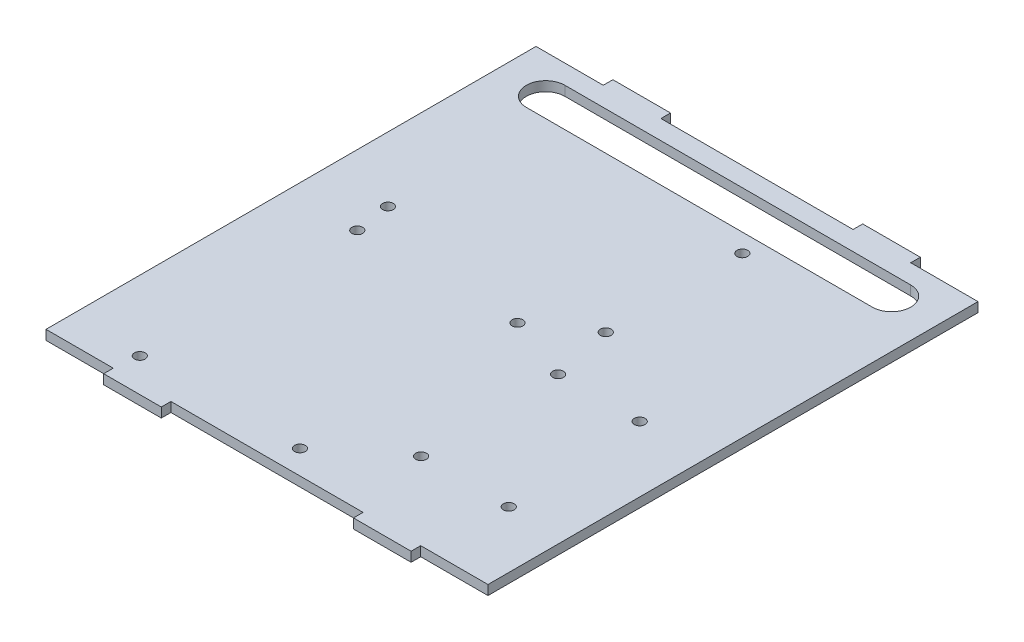
ISO-10303-21;
HEADER;
FILE_DESCRIPTION(('STEP AP214'),'2;1');
FILE_NAME('part.step','',(''),(''),'','','');
FILE_SCHEMA(('AUTOMOTIVE_DESIGN { 1 0 10303 214 1 1 1 1 }'));
ENDSEC;
DATA;
#1=APPLICATION_CONTEXT('core data for automotive mechanical design processes');
#2=APPLICATION_PROTOCOL_DEFINITION('international standard','automotive_design',2000,#1);
#3=PRODUCT_CONTEXT('',#1,'mechanical');
#4=PRODUCT('Part','Part','',(#3));
#5=PRODUCT_RELATED_PRODUCT_CATEGORY('part','',(#4));
#6=PRODUCT_DEFINITION_FORMATION('','',#4);
#7=PRODUCT_DEFINITION_CONTEXT('part definition',#1,'design');
#8=PRODUCT_DEFINITION('design','',#6,#7);
#9=PRODUCT_DEFINITION_SHAPE('','',#8);
#10=(LENGTH_UNIT() NAMED_UNIT(*) SI_UNIT(.MILLI.,.METRE.));
#11=(NAMED_UNIT(*) PLANE_ANGLE_UNIT() SI_UNIT($,.RADIAN.));
#12=(NAMED_UNIT(*) SI_UNIT($,.STERADIAN.) SOLID_ANGLE_UNIT());
#13=UNCERTAINTY_MEASURE_WITH_UNIT(LENGTH_MEASURE(1.E-05),#10,'distance_accuracy_value','');
#14=(GEOMETRIC_REPRESENTATION_CONTEXT(3) GLOBAL_UNCERTAINTY_ASSIGNED_CONTEXT((#13)) GLOBAL_UNIT_ASSIGNED_CONTEXT((#10,
#11,#12)) REPRESENTATION_CONTEXT('',''));
#15=CARTESIAN_POINT('',(0.,0.,0.));
#16=DIRECTION('',(0.,0.,1.));
#17=DIRECTION('',(1.,0.,0.));
#18=AXIS2_PLACEMENT_3D('',#15,#16,#17);
#19=CARTESIAN_POINT('',(73.025,3.175,80.9625));
#20=DIRECTION('',(0.,0.,-1.));
#21=DIRECTION('',(-1.,0.,0.));
#22=AXIS2_PLACEMENT_3D('',#19,#20,#21);
#23=PLANE('',#22);
#24=DIRECTION('',(1.,0.,0.));
#25=VECTOR('',#24,1.);
#26=CARTESIAN_POINT('',(73.025,0.,80.9625));
#27=LINE('',#26,#25);
#28=CARTESIAN_POINT('',(-73.025,0.,80.9625));
#29=VERTEX_POINT('',#28);
#30=CARTESIAN_POINT('',(-50.8,0.,80.9625));
#31=VERTEX_POINT('',#30);
#32=EDGE_CURVE('E279',#29,#31,#27,.T.);
#33=ORIENTED_EDGE('',*,*,#32,.T.);
#34=DIRECTION('',(0.,1.,0.));
#35=VECTOR('',#34,1.);
#36=CARTESIAN_POINT('',(-50.8,-19.3127710336968,80.9625));
#37=LINE('',#36,#35);
#38=CARTESIAN_POINT('',(-50.8,3.175,80.9625));
#39=VERTEX_POINT('',#38);
#40=EDGE_CURVE('E241',#31,#39,#37,.T.);
#41=ORIENTED_EDGE('',*,*,#40,.T.);
#42=DIRECTION('',(1.,0.,0.));
#43=VECTOR('',#42,1.);
#44=CARTESIAN_POINT('',(73.025,3.175,80.9625));
#45=LINE('',#44,#43);
#46=CARTESIAN_POINT('',(-73.025,3.175,80.9625));
#47=VERTEX_POINT('',#46);
#48=EDGE_CURVE('E381',#47,#39,#45,.T.);
#49=ORIENTED_EDGE('',*,*,#48,.F.);
#50=DIRECTION('',(0.,-1.,0.));
#51=VECTOR('',#50,1.);
#52=CARTESIAN_POINT('',(-73.025,3.175,80.9625));
#53=LINE('',#52,#51);
#54=EDGE_CURVE('E329',#47,#29,#53,.T.);
#55=ORIENTED_EDGE('',*,*,#54,.T.);
#56=EDGE_LOOP('',(#33,#41,#49,#55));
#57=FACE_BOUND('',#56,.T.);
#58=ADVANCED_FACE('F34',(#57),#23,.F.);
#59=DIRECTION('',(0.,1.,0.));
#60=VECTOR('',#59,1.);
#61=CARTESIAN_POINT('',(50.8,-19.3127710336968,80.9625));
#62=LINE('',#61,#60);
#63=CARTESIAN_POINT('',(50.8,0.,80.9625));
#64=VERTEX_POINT('',#63);
#65=CARTESIAN_POINT('',(50.8,3.175,80.9625));
#66=VERTEX_POINT('',#65);
#67=EDGE_CURVE('E267',#64,#66,#62,.T.);
#68=ORIENTED_EDGE('',*,*,#67,.F.);
#69=CARTESIAN_POINT('',(73.025,0.,80.9625));
#70=VERTEX_POINT('',#69);
#71=EDGE_CURVE('E280',#64,#70,#27,.T.);
#72=ORIENTED_EDGE('',*,*,#71,.T.);
#73=DIRECTION('',(0.,-1.,0.));
#74=VECTOR('',#73,1.);
#75=CARTESIAN_POINT('',(73.025,3.175,80.9625));
#76=LINE('',#75,#74);
#77=CARTESIAN_POINT('',(73.025,3.175,80.9625));
#78=VERTEX_POINT('',#77);
#79=EDGE_CURVE('E327',#78,#70,#76,.T.);
#80=ORIENTED_EDGE('',*,*,#79,.F.);
#81=EDGE_CURVE('E382',#66,#78,#45,.T.);
#82=ORIENTED_EDGE('',*,*,#81,.F.);
#83=EDGE_LOOP('',(#68,#72,#80,#82));
#84=FACE_BOUND('',#83,.T.);
#85=ADVANCED_FACE('F358',(#84),#23,.F.);
#86=CARTESIAN_POINT('',(73.025,3.175,-80.9625));
#87=DIRECTION('',(0.,0.,1.));
#88=DIRECTION('',(1.,0.,0.));
#89=AXIS2_PLACEMENT_3D('',#86,#87,#88);
#90=PLANE('',#89);
#91=DIRECTION('',(-1.,0.,0.));
#92=VECTOR('',#91,1.);
#93=CARTESIAN_POINT('',(73.025,3.175,-80.9625));
#94=LINE('',#93,#92);
#95=CARTESIAN_POINT('',(31.75,3.175,-80.9625));
#96=VERTEX_POINT('',#95);
#97=CARTESIAN_POINT('',(-31.75,3.175,-80.9625));
#98=VERTEX_POINT('',#97);
#99=EDGE_CURVE('E297',#96,#98,#94,.T.);
#100=ORIENTED_EDGE('',*,*,#99,.F.);
#101=DIRECTION('',(0.,1.,0.));
#102=VECTOR('',#101,1.);
#103=CARTESIAN_POINT('',(31.75,-19.3127710336968,-80.9625));
#104=LINE('',#103,#102);
#105=CARTESIAN_POINT('',(31.75,0.,-80.9625));
#106=VERTEX_POINT('',#105);
#107=EDGE_CURVE('E477',#106,#96,#104,.T.);
#108=ORIENTED_EDGE('',*,*,#107,.F.);
#109=DIRECTION('',(-1.,0.,0.));
#110=VECTOR('',#109,1.);
#111=CARTESIAN_POINT('',(73.025,0.,-80.9625));
#112=LINE('',#111,#110);
#113=CARTESIAN_POINT('',(-31.75,0.,-80.9625));
#114=VERTEX_POINT('',#113);
#115=EDGE_CURVE('E301',#106,#114,#112,.T.);
#116=ORIENTED_EDGE('',*,*,#115,.T.);
#117=DIRECTION('',(0.,1.,0.));
#118=VECTOR('',#117,1.);
#119=CARTESIAN_POINT('',(-31.75,-19.3127710336968,-80.9625));
#120=LINE('',#119,#118);
#121=EDGE_CURVE('E413',#114,#98,#120,.T.);
#122=ORIENTED_EDGE('',*,*,#121,.T.);
#123=EDGE_LOOP('',(#100,#108,#116,#122));
#124=FACE_BOUND('',#123,.T.);
#125=ADVANCED_FACE('F363',(#124),#90,.F.);
#126=DIRECTION('',(0.,1.,0.));
#127=VECTOR('',#126,1.);
#128=CARTESIAN_POINT('',(-50.8,-19.3127710336968,-80.9625));
#129=LINE('',#128,#127);
#130=CARTESIAN_POINT('',(-50.8,0.,-80.9625));
#131=VERTEX_POINT('',#130);
#132=CARTESIAN_POINT('',(-50.8,3.175,-80.9625));
#133=VERTEX_POINT('',#132);
#134=EDGE_CURVE('E410',#131,#133,#129,.T.);
#135=ORIENTED_EDGE('',*,*,#134,.F.);
#136=CARTESIAN_POINT('',(-73.025,0.,-80.9625));
#137=VERTEX_POINT('',#136);
#138=EDGE_CURVE('E314',#131,#137,#112,.T.);
#139=ORIENTED_EDGE('',*,*,#138,.T.);
#140=DIRECTION('',(0.,-1.,0.));
#141=VECTOR('',#140,1.);
#142=CARTESIAN_POINT('',(-73.025,3.175,-80.9625));
#143=LINE('',#142,#141);
#144=CARTESIAN_POINT('',(-73.025,3.175,-80.9625));
#145=VERTEX_POINT('',#144);
#146=EDGE_CURVE('E313',#145,#137,#143,.T.);
#147=ORIENTED_EDGE('',*,*,#146,.F.);
#148=EDGE_CURVE('E300',#133,#145,#94,.T.);
#149=ORIENTED_EDGE('',*,*,#148,.F.);
#150=EDGE_LOOP('',(#135,#139,#147,#149));
#151=FACE_BOUND('',#150,.T.);
#152=ADVANCED_FACE('F375',(#151),#90,.F.);
#153=CARTESIAN_POINT('',(-73.025,3.175,80.9625));
#154=DIRECTION('',(1.,0.,0.));
#155=DIRECTION('',(0.,0.,-1.));
#156=AXIS2_PLACEMENT_3D('',#153,#154,#155);
#157=PLANE('',#156);
#158=DIRECTION('',(0.,0.,1.));
#159=VECTOR('',#158,1.);
#160=CARTESIAN_POINT('',(-73.025,0.,80.9625));
#161=LINE('',#160,#159);
#162=EDGE_CURVE('E287',#137,#29,#161,.T.);
#163=ORIENTED_EDGE('',*,*,#162,.T.);
#164=ORIENTED_EDGE('',*,*,#54,.F.);
#165=DIRECTION('',(0.,0.,1.));
#166=VECTOR('',#165,1.);
#167=CARTESIAN_POINT('',(-73.025,3.175,80.9625));
#168=LINE('',#167,#166);
#169=EDGE_CURVE('E398',#145,#47,#168,.T.);
#170=ORIENTED_EDGE('',*,*,#169,.F.);
#171=ORIENTED_EDGE('',*,*,#146,.T.);
#172=EDGE_LOOP('',(#163,#164,#170,#171));
#173=FACE_BOUND('',#172,.T.);
#174=ADVANCED_FACE('F36',(#173),#157,.F.);
#175=CARTESIAN_POINT('',(-31.75,3.175,80.9625));
#176=VERTEX_POINT('',#175);
#177=CARTESIAN_POINT('',(31.75,3.175,80.9625));
#178=VERTEX_POINT('',#177);
#179=EDGE_CURVE('E281',#176,#178,#45,.T.);
#180=ORIENTED_EDGE('',*,*,#179,.F.);
#181=DIRECTION('',(0.,1.,0.));
#182=VECTOR('',#181,1.);
#183=CARTESIAN_POINT('',(-31.75,-19.3127710336968,80.9625));
#184=LINE('',#183,#182);
#185=CARTESIAN_POINT('',(-31.75,0.,80.9625));
#186=VERTEX_POINT('',#185);
#187=EDGE_CURVE('E243',#186,#176,#184,.T.);
#188=ORIENTED_EDGE('',*,*,#187,.F.);
#189=CARTESIAN_POINT('',(31.75,0.,80.9625));
#190=VERTEX_POINT('',#189);
#191=EDGE_CURVE('E276',#186,#190,#27,.T.);
#192=ORIENTED_EDGE('',*,*,#191,.T.);
#193=DIRECTION('',(0.,1.,0.));
#194=VECTOR('',#193,1.);
#195=CARTESIAN_POINT('',(31.75,-19.3127710336968,80.9625));
#196=LINE('',#195,#194);
#197=EDGE_CURVE('E258',#190,#178,#196,.T.);
#198=ORIENTED_EDGE('',*,*,#197,.T.);
#199=EDGE_LOOP('',(#180,#188,#192,#198));
#200=FACE_BOUND('',#199,.T.);
#201=ADVANCED_FACE('F359',(#200),#23,.F.);
#202=CARTESIAN_POINT('',(73.025,3.175,80.9625));
#203=DIRECTION('',(-1.,0.,0.));
#204=DIRECTION('',(0.,0.,1.));
#205=AXIS2_PLACEMENT_3D('',#202,#203,#204);
#206=PLANE('',#205);
#207=DIRECTION('',(0.,0.,-1.));
#208=VECTOR('',#207,1.);
#209=CARTESIAN_POINT('',(73.025,0.,80.9625));
#210=LINE('',#209,#208);
#211=CARTESIAN_POINT('',(73.025,0.,-80.9625));
#212=VERTEX_POINT('',#211);
#213=EDGE_CURVE('E289',#70,#212,#210,.T.);
#214=ORIENTED_EDGE('',*,*,#213,.T.);
#215=DIRECTION('',(0.,-1.,0.));
#216=VECTOR('',#215,1.);
#217=CARTESIAN_POINT('',(73.025,3.175,-80.9625));
#218=LINE('',#217,#216);
#219=CARTESIAN_POINT('',(73.025,3.175,-80.9625));
#220=VERTEX_POINT('',#219);
#221=EDGE_CURVE('E324',#220,#212,#218,.T.);
#222=ORIENTED_EDGE('',*,*,#221,.F.);
#223=DIRECTION('',(0.,0.,-1.));
#224=VECTOR('',#223,1.);
#225=CARTESIAN_POINT('',(73.025,3.175,80.9625));
#226=LINE('',#225,#224);
#227=EDGE_CURVE('E305',#78,#220,#226,.T.);
#228=ORIENTED_EDGE('',*,*,#227,.F.);
#229=ORIENTED_EDGE('',*,*,#79,.T.);
#230=EDGE_LOOP('',(#214,#222,#228,#229));
#231=FACE_BOUND('',#230,.T.);
#232=ADVANCED_FACE('F367',(#231),#206,.F.);
#233=CARTESIAN_POINT('',(50.8,0.,-80.9625));
#234=VERTEX_POINT('',#233);
#235=EDGE_CURVE('E316',#212,#234,#112,.T.);
#236=ORIENTED_EDGE('',*,*,#235,.T.);
#237=DIRECTION('',(0.,1.,0.));
#238=VECTOR('',#237,1.);
#239=CARTESIAN_POINT('',(50.8,-19.3127710336968,-80.9625));
#240=LINE('',#239,#238);
#241=CARTESIAN_POINT('',(50.8,3.175,-80.9625));
#242=VERTEX_POINT('',#241);
#243=EDGE_CURVE('E498',#234,#242,#240,.T.);
#244=ORIENTED_EDGE('',*,*,#243,.T.);
#245=EDGE_CURVE('E299',#220,#242,#94,.T.);
#246=ORIENTED_EDGE('',*,*,#245,.F.);
#247=ORIENTED_EDGE('',*,*,#221,.T.);
#248=EDGE_LOOP('',(#236,#244,#246,#247));
#249=FACE_BOUND('',#248,.T.);
#250=ADVANCED_FACE('F373',(#249),#90,.F.);
#251=CARTESIAN_POINT('',(0.,3.175,0.));
#252=DIRECTION('',(0.,1.,0.));
#253=DIRECTION('',(0.,0.,1.));
#254=AXIS2_PLACEMENT_3D('',#251,#252,#253);
#255=PLANE('',#254);
#256=CARTESIAN_POINT('',(-49.911,3.175,73.0885));
#257=DIRECTION('',(0.,1.,0.));
#258=DIRECTION('',(0.,0.,1.));
#259=AXIS2_PLACEMENT_3D('',#256,#257,#258);
#260=CIRCLE('',#259,1.77800000000002);
#261=CARTESIAN_POINT('',(-49.911,3.175,74.8665));
#262=VERTEX_POINT('',#261);
#263=EDGE_CURVE('E841',#262,#262,#260,.T.);
#264=ORIENTED_EDGE('',*,*,#263,.F.);
#265=EDGE_LOOP('',(#264));
#266=FACE_BOUND('',#265,.T.);
#267=CARTESIAN_POINT('',(-49.911,3.175,1.20649999999999));
#268=DIRECTION('',(0.,1.,0.));
#269=DIRECTION('',(0.,0.,1.));
#270=AXIS2_PLACEMENT_3D('',#267,#268,#269);
#271=CIRCLE('',#270,1.77799999999999);
#272=CARTESIAN_POINT('',(-49.911,3.175,2.98449999999999));
#273=VERTEX_POINT('',#272);
#274=EDGE_CURVE('E854',#273,#273,#271,.T.);
#275=ORIENTED_EDGE('',*,*,#274,.F.);
#276=EDGE_LOOP('',(#275));
#277=FACE_BOUND('',#276,.T.);
#278=CARTESIAN_POINT('',(3.02259999999999,3.175,1.2065));
#279=DIRECTION('',(0.,1.,0.));
#280=DIRECTION('',(0.,0.,1.));
#281=AXIS2_PLACEMENT_3D('',#278,#279,#280);
#282=CIRCLE('',#281,1.778);
#283=CARTESIAN_POINT('',(3.02259999999999,3.175,2.9845));
#284=VERTEX_POINT('',#283);
#285=EDGE_CURVE('E915',#284,#284,#282,.T.);
#286=ORIENTED_EDGE('',*,*,#285,.F.);
#287=EDGE_LOOP('',(#286));
#288=FACE_BOUND('',#287,.T.);
#289=CARTESIAN_POINT('',(-51.689,3.175,-10.6807));
#290=DIRECTION('',(0.,1.,0.));
#291=DIRECTION('',(0.,0.,1.));
#292=AXIS2_PLACEMENT_3D('',#289,#290,#291);
#293=CIRCLE('',#292,1.778);
#294=CARTESIAN_POINT('',(-51.689,3.175,-8.9027));
#295=VERTEX_POINT('',#294);
#296=EDGE_CURVE('E921',#295,#295,#293,.T.);
#297=ORIENTED_EDGE('',*,*,#296,.F.);
#298=EDGE_LOOP('',(#297));
#299=FACE_BOUND('',#298,.T.);
#300=CARTESIAN_POINT('',(25.273,3.175,55.3084999999999));
#301=DIRECTION('',(0.,1.,0.));
#302=DIRECTION('',(0.,0.,1.));
#303=AXIS2_PLACEMENT_3D('',#300,#301,#302);
#304=CIRCLE('',#303,1.778);
#305=CARTESIAN_POINT('',(25.273,3.175,57.0864999999999));
#306=VERTEX_POINT('',#305);
#307=EDGE_CURVE('E869',#306,#306,#304,.T.);
#308=ORIENTED_EDGE('',*,*,#307,.F.);
#309=EDGE_LOOP('',(#308));
#310=FACE_BOUND('',#309,.T.);
#311=CARTESIAN_POINT('',(24.4602,3.175,9.2328999999999));
#312=DIRECTION('',(0.,1.,0.));
#313=DIRECTION('',(0.,0.,1.));
#314=AXIS2_PLACEMENT_3D('',#311,#312,#313);
#315=CIRCLE('',#314,1.778);
#316=CARTESIAN_POINT('',(24.4602,3.175,11.0108999999999));
#317=VERTEX_POINT('',#316);
#318=EDGE_CURVE('E865',#317,#317,#315,.T.);
#319=ORIENTED_EDGE('',*,*,#318,.F.);
#320=EDGE_LOOP('',(#319));
#321=FACE_BOUND('',#320,.T.);
#322=CARTESIAN_POINT('',(51.435,3.175,9.2328999999999));
#323=DIRECTION('',(0.,1.,0.));
#324=DIRECTION('',(0.,0.,1.));
#325=AXIS2_PLACEMENT_3D('',#322,#323,#324);
#326=CIRCLE('',#325,1.778);
#327=CARTESIAN_POINT('',(51.435,3.175,11.0108999999999));
#328=VERTEX_POINT('',#327);
#329=EDGE_CURVE('E860',#328,#328,#326,.T.);
#330=ORIENTED_EDGE('',*,*,#329,.F.);
#331=EDGE_LOOP('',(#330));
#332=FACE_BOUND('',#331,.T.);
#333=CARTESIAN_POINT('',(3.02259999999999,3.175,73.0885));
#334=DIRECTION('',(0.,1.,0.));
#335=DIRECTION('',(0.,0.,1.));
#336=AXIS2_PLACEMENT_3D('',#333,#334,#335);
#337=CIRCLE('',#336,1.77800000000001);
#338=CARTESIAN_POINT('',(3.02259999999999,3.175,74.8665));
#339=VERTEX_POINT('',#338);
#340=EDGE_CURVE('E845',#339,#339,#337,.T.);
#341=ORIENTED_EDGE('',*,*,#340,.F.);
#342=EDGE_LOOP('',(#341));
#343=FACE_BOUND('',#342,.T.);
#344=CARTESIAN_POINT('',(20.2946,3.175,-10.6807));
#345=DIRECTION('',(0.,1.,0.));
#346=DIRECTION('',(0.,0.,1.));
#347=AXIS2_PLACEMENT_3D('',#344,#345,#346);
#348=CIRCLE('',#347,1.778);
#349=CARTESIAN_POINT('',(20.2946,3.175,-8.9027));
#350=VERTEX_POINT('',#349);
#351=EDGE_CURVE('E906',#350,#350,#348,.T.);
#352=ORIENTED_EDGE('',*,*,#351,.F.);
#353=EDGE_LOOP('',(#352));
#354=FACE_BOUND('',#353,.T.);
#355=CARTESIAN_POINT('',(20.2946,3.175,-55.8165));
#356=DIRECTION('',(0.,1.,0.));
#357=DIRECTION('',(0.,0.,1.));
#358=AXIS2_PLACEMENT_3D('',#355,#356,#357);
#359=CIRCLE('',#358,1.778);
#360=CARTESIAN_POINT('',(20.2946,3.175,-54.0385));
#361=VERTEX_POINT('',#360);
#362=EDGE_CURVE('E907',#361,#361,#359,.T.);
#363=ORIENTED_EDGE('',*,*,#362,.F.);
#364=EDGE_LOOP('',(#363));
#365=FACE_BOUND('',#364,.T.);
#366=CARTESIAN_POINT('',(54.229,3.175,55.3084999999999));
#367=DIRECTION('',(0.,1.,0.));
#368=DIRECTION('',(0.,0.,1.));
#369=AXIS2_PLACEMENT_3D('',#366,#367,#368);
#370=CIRCLE('',#369,1.778);
#371=CARTESIAN_POINT('',(54.229,3.175,57.0864999999999));
#372=VERTEX_POINT('',#371);
#373=EDGE_CURVE('E876',#372,#372,#370,.T.);
#374=ORIENTED_EDGE('',*,*,#373,.F.);
#375=EDGE_LOOP('',(#374));
#376=FACE_BOUND('',#375,.T.);
#377=CARTESIAN_POINT('',(-57.15,3.175,-68.2625));
#378=DIRECTION('',(0.,1.,0.));
#379=DIRECTION('',(0.,0.,1.));
#380=AXIS2_PLACEMENT_3D('',#377,#378,#379);
#381=CIRCLE('',#380,6.34999999999999);
#382=CARTESIAN_POINT('',(-57.15,3.175,-74.6125));
#383=VERTEX_POINT('',#382);
#384=CARTESIAN_POINT('',(-57.15,3.175,-61.9125));
#385=VERTEX_POINT('',#384);
#386=EDGE_CURVE('E49',#383,#385,#381,.T.);
#387=ORIENTED_EDGE('',*,*,#386,.F.);
#388=DIRECTION('',(-1.,0.,0.));
#389=VECTOR('',#388,1.);
#390=CARTESIAN_POINT('',(-57.15,3.175,-74.6125));
#391=LINE('',#390,#389);
#392=CARTESIAN_POINT('',(57.15,3.175,-74.6125));
#393=VERTEX_POINT('',#392);
#394=EDGE_CURVE('E214',#393,#383,#391,.T.);
#395=ORIENTED_EDGE('',*,*,#394,.F.);
#396=CARTESIAN_POINT('',(57.15,3.175,-68.2625));
#397=DIRECTION('',(0.,1.,0.));
#398=DIRECTION('',(0.,0.,1.));
#399=AXIS2_PLACEMENT_3D('',#396,#397,#398);
#400=CIRCLE('',#399,6.34999999999999);
#401=CARTESIAN_POINT('',(57.15,3.175,-61.9125));
#402=VERTEX_POINT('',#401);
#403=EDGE_CURVE('E198',#402,#393,#400,.T.);
#404=ORIENTED_EDGE('',*,*,#403,.F.);
#405=DIRECTION('',(1.,0.,0.));
#406=VECTOR('',#405,1.);
#407=CARTESIAN_POINT('',(-57.15,3.175,-61.9125));
#408=LINE('',#407,#406);
#409=EDGE_CURVE('E207',#385,#402,#408,.T.);
#410=ORIENTED_EDGE('',*,*,#409,.F.);
#411=EDGE_LOOP('',(#387,#395,#404,#410));
#412=FACE_BOUND('',#411,.T.);
#413=ORIENTED_EDGE('',*,*,#169,.T.);
#414=ORIENTED_EDGE('',*,*,#48,.T.);
#415=DIRECTION('',(0.,0.,1.));
#416=VECTOR('',#415,1.);
#417=CARTESIAN_POINT('',(-50.8,3.175,84.1375));
#418=LINE('',#417,#416);
#419=CARTESIAN_POINT('',(-50.8,3.175,84.1375));
#420=VERTEX_POINT('',#419);
#421=EDGE_CURVE('E236',#39,#420,#418,.T.);
#422=ORIENTED_EDGE('',*,*,#421,.T.);
#423=DIRECTION('',(1.,0.,0.));
#424=VECTOR('',#423,1.);
#425=CARTESIAN_POINT('',(-50.8,3.175,84.1375));
#426=LINE('',#425,#424);
#427=CARTESIAN_POINT('',(-31.75,3.175,84.1375));
#428=VERTEX_POINT('',#427);
#429=EDGE_CURVE('E221',#420,#428,#426,.T.);
#430=ORIENTED_EDGE('',*,*,#429,.T.);
#431=DIRECTION('',(0.,0.,-1.));
#432=VECTOR('',#431,1.);
#433=CARTESIAN_POINT('',(-31.75,3.175,84.1375));
#434=LINE('',#433,#432);
#435=EDGE_CURVE('E233',#428,#176,#434,.T.);
#436=ORIENTED_EDGE('',*,*,#435,.T.);
#437=ORIENTED_EDGE('',*,*,#179,.T.);
#438=DIRECTION('',(0.,0.,1.));
#439=VECTOR('',#438,1.);
#440=CARTESIAN_POINT('',(31.75,3.175,84.1375));
#441=LINE('',#440,#439);
#442=CARTESIAN_POINT('',(31.75,3.175,84.1375));
#443=VERTEX_POINT('',#442);
#444=EDGE_CURVE('E270',#178,#443,#441,.T.);
#445=ORIENTED_EDGE('',*,*,#444,.T.);
#446=DIRECTION('',(1.,0.,0.));
#447=VECTOR('',#446,1.);
#448=CARTESIAN_POINT('',(31.75,3.175,84.1375));
#449=LINE('',#448,#447);
#450=CARTESIAN_POINT('',(50.8,3.175,84.1375));
#451=VERTEX_POINT('',#450);
#452=EDGE_CURVE('E248',#443,#451,#449,.T.);
#453=ORIENTED_EDGE('',*,*,#452,.T.);
#454=DIRECTION('',(0.,0.,-1.));
#455=VECTOR('',#454,1.);
#456=CARTESIAN_POINT('',(50.8,3.175,84.1375));
#457=LINE('',#456,#455);
#458=EDGE_CURVE('E255',#451,#66,#457,.T.);
#459=ORIENTED_EDGE('',*,*,#458,.T.);
#460=ORIENTED_EDGE('',*,*,#81,.T.);
#461=ORIENTED_EDGE('',*,*,#227,.T.);
#462=ORIENTED_EDGE('',*,*,#245,.T.);
#463=DIRECTION('',(0.,0.,-1.));
#464=VECTOR('',#463,1.);
#465=CARTESIAN_POINT('',(50.8,3.175,-84.1375));
#466=LINE('',#465,#464);
#467=CARTESIAN_POINT('',(50.8,3.175,-84.1375));
#468=VERTEX_POINT('',#467);
#469=EDGE_CURVE('E504',#242,#468,#466,.T.);
#470=ORIENTED_EDGE('',*,*,#469,.T.);
#471=DIRECTION('',(-1.,0.,0.));
#472=VECTOR('',#471,1.);
#473=CARTESIAN_POINT('',(31.75,3.175,-84.1375));
#474=LINE('',#473,#472);
#475=CARTESIAN_POINT('',(31.75,3.175,-84.1375));
#476=VERTEX_POINT('',#475);
#477=EDGE_CURVE('E501',#468,#476,#474,.T.);
#478=ORIENTED_EDGE('',*,*,#477,.T.);
#479=DIRECTION('',(0.,0.,1.));
#480=VECTOR('',#479,1.);
#481=CARTESIAN_POINT('',(31.75,3.175,-84.1375));
#482=LINE('',#481,#480);
#483=EDGE_CURVE('E494',#476,#96,#482,.T.);
#484=ORIENTED_EDGE('',*,*,#483,.T.);
#485=ORIENTED_EDGE('',*,*,#99,.T.);
#486=DIRECTION('',(0.,0.,-1.));
#487=VECTOR('',#486,1.);
#488=CARTESIAN_POINT('',(-31.75,3.175,-84.1375));
#489=LINE('',#488,#487);
#490=CARTESIAN_POINT('',(-31.75,3.175,-84.1375));
#491=VERTEX_POINT('',#490);
#492=EDGE_CURVE('E418',#98,#491,#489,.T.);
#493=ORIENTED_EDGE('',*,*,#492,.T.);
#494=DIRECTION('',(-1.,0.,0.));
#495=VECTOR('',#494,1.);
#496=CARTESIAN_POINT('',(-50.8,3.175,-84.1375));
#497=LINE('',#496,#495);
#498=CARTESIAN_POINT('',(-50.8,3.175,-84.1375));
#499=VERTEX_POINT('',#498);
#500=EDGE_CURVE('E414',#491,#499,#497,.T.);
#501=ORIENTED_EDGE('',*,*,#500,.T.);
#502=DIRECTION('',(0.,0.,1.));
#503=VECTOR('',#502,1.);
#504=CARTESIAN_POINT('',(-50.8,3.175,-84.1375));
#505=LINE('',#504,#503);
#506=EDGE_CURVE('E415',#499,#133,#505,.T.);
#507=ORIENTED_EDGE('',*,*,#506,.T.);
#508=ORIENTED_EDGE('',*,*,#148,.T.);
#509=EDGE_LOOP('',(#413,#414,#422,#430,#436,#437,#445,#453,#459,#460,#461,#462,#470,#478,#484,
#485,#493,#501,#507,#508));
#510=FACE_BOUND('',#509,.T.);
#511=ADVANCED_FACE('F211',(#266,#277,#288,#299,#310,#321,#332,#343,#354,#365,#376,#412,#510),
#255,.T.);
#512=CARTESIAN_POINT('',(0.,0.,0.));
#513=DIRECTION('',(0.,1.,0.));
#514=DIRECTION('',(0.,0.,1.));
#515=AXIS2_PLACEMENT_3D('',#512,#513,#514);
#516=PLANE('',#515);
#517=CARTESIAN_POINT('',(-49.911,0.,73.0885));
#518=DIRECTION('',(0.,1.,0.));
#519=DIRECTION('',(0.,0.,1.));
#520=AXIS2_PLACEMENT_3D('',#517,#518,#519);
#521=CIRCLE('',#520,1.77800000000002);
#522=CARTESIAN_POINT('',(-49.911,0.,74.8665));
#523=VERTEX_POINT('',#522);
#524=EDGE_CURVE('E844',#523,#523,#521,.F.);
#525=ORIENTED_EDGE('',*,*,#524,.F.);
#526=EDGE_LOOP('',(#525));
#527=FACE_BOUND('',#526,.T.);
#528=CARTESIAN_POINT('',(-49.911,0.,1.20649999999999));
#529=DIRECTION('',(0.,1.,0.));
#530=DIRECTION('',(0.,0.,1.));
#531=AXIS2_PLACEMENT_3D('',#528,#529,#530);
#532=CIRCLE('',#531,1.77799999999999);
#533=CARTESIAN_POINT('',(-49.911,0.,2.98449999999999));
#534=VERTEX_POINT('',#533);
#535=EDGE_CURVE('E850',#534,#534,#532,.F.);
#536=ORIENTED_EDGE('',*,*,#535,.F.);
#537=EDGE_LOOP('',(#536));
#538=FACE_BOUND('',#537,.T.);
#539=CARTESIAN_POINT('',(3.02259999999999,0.,1.2065));
#540=DIRECTION('',(0.,1.,0.));
#541=DIRECTION('',(0.,0.,1.));
#542=AXIS2_PLACEMENT_3D('',#539,#540,#541);
#543=CIRCLE('',#542,1.778);
#544=CARTESIAN_POINT('',(3.02259999999999,0.,2.9845));
#545=VERTEX_POINT('',#544);
#546=EDGE_CURVE('E857',#545,#545,#543,.F.);
#547=ORIENTED_EDGE('',*,*,#546,.F.);
#548=EDGE_LOOP('',(#547));
#549=FACE_BOUND('',#548,.T.);
#550=CARTESIAN_POINT('',(-51.689,0.,-10.6807));
#551=DIRECTION('',(0.,1.,0.));
#552=DIRECTION('',(0.,0.,1.));
#553=AXIS2_PLACEMENT_3D('',#550,#551,#552);
#554=CIRCLE('',#553,1.778);
#555=CARTESIAN_POINT('',(-51.689,0.,-8.9027));
#556=VERTEX_POINT('',#555);
#557=EDGE_CURVE('E918',#556,#556,#554,.F.);
#558=ORIENTED_EDGE('',*,*,#557,.F.);
#559=EDGE_LOOP('',(#558));
#560=FACE_BOUND('',#559,.T.);
#561=CARTESIAN_POINT('',(25.273,0.,55.3084999999999));
#562=DIRECTION('',(0.,1.,0.));
#563=DIRECTION('',(0.,0.,1.));
#564=AXIS2_PLACEMENT_3D('',#561,#562,#563);
#565=CIRCLE('',#564,1.778);
#566=CARTESIAN_POINT('',(25.273,0.,57.0864999999999));
#567=VERTEX_POINT('',#566);
#568=EDGE_CURVE('E872',#567,#567,#565,.F.);
#569=ORIENTED_EDGE('',*,*,#568,.F.);
#570=EDGE_LOOP('',(#569));
#571=FACE_BOUND('',#570,.T.);
#572=CARTESIAN_POINT('',(24.4602,0.,9.2328999999999));
#573=DIRECTION('',(0.,1.,0.));
#574=DIRECTION('',(0.,0.,1.));
#575=AXIS2_PLACEMENT_3D('',#572,#573,#574);
#576=CIRCLE('',#575,1.778);
#577=CARTESIAN_POINT('',(24.4602,0.,11.0108999999999));
#578=VERTEX_POINT('',#577);
#579=EDGE_CURVE('E873',#578,#578,#576,.F.);
#580=ORIENTED_EDGE('',*,*,#579,.F.);
#581=EDGE_LOOP('',(#580));
#582=FACE_BOUND('',#581,.T.);
#583=CARTESIAN_POINT('',(51.435,0.,9.2328999999999));
#584=DIRECTION('',(0.,1.,0.));
#585=DIRECTION('',(0.,0.,1.));
#586=AXIS2_PLACEMENT_3D('',#583,#584,#585);
#587=CIRCLE('',#586,1.778);
#588=CARTESIAN_POINT('',(51.435,0.,11.0108999999999));
#589=VERTEX_POINT('',#588);
#590=EDGE_CURVE('E863',#589,#589,#587,.F.);
#591=ORIENTED_EDGE('',*,*,#590,.F.);
#592=EDGE_LOOP('',(#591));
#593=FACE_BOUND('',#592,.T.);
#594=CARTESIAN_POINT('',(3.02259999999999,0.,73.0885));
#595=DIRECTION('',(0.,1.,0.));
#596=DIRECTION('',(0.,0.,1.));
#597=AXIS2_PLACEMENT_3D('',#594,#595,#596);
#598=CIRCLE('',#597,1.77800000000001);
#599=CARTESIAN_POINT('',(3.02259999999999,0.,74.8665));
#600=VERTEX_POINT('',#599);
#601=EDGE_CURVE('E848',#600,#600,#598,.F.);
#602=ORIENTED_EDGE('',*,*,#601,.F.);
#603=EDGE_LOOP('',(#602));
#604=FACE_BOUND('',#603,.T.);
#605=CARTESIAN_POINT('',(20.2946,0.,-10.6807));
#606=DIRECTION('',(0.,1.,0.));
#607=DIRECTION('',(0.,0.,1.));
#608=AXIS2_PLACEMENT_3D('',#605,#606,#607);
#609=CIRCLE('',#608,1.778);
#610=CARTESIAN_POINT('',(20.2946,0.,-8.9027));
#611=VERTEX_POINT('',#610);
#612=EDGE_CURVE('E901',#611,#611,#609,.F.);
#613=ORIENTED_EDGE('',*,*,#612,.F.);
#614=EDGE_LOOP('',(#613));
#615=FACE_BOUND('',#614,.T.);
#616=CARTESIAN_POINT('',(20.2946,0.,-55.8165));
#617=DIRECTION('',(0.,1.,0.));
#618=DIRECTION('',(0.,0.,1.));
#619=AXIS2_PLACEMENT_3D('',#616,#617,#618);
#620=CIRCLE('',#619,1.778);
#621=CARTESIAN_POINT('',(20.2946,0.,-54.0385));
#622=VERTEX_POINT('',#621);
#623=EDGE_CURVE('E904',#622,#622,#620,.F.);
#624=ORIENTED_EDGE('',*,*,#623,.F.);
#625=EDGE_LOOP('',(#624));
#626=FACE_BOUND('',#625,.T.);
#627=CARTESIAN_POINT('',(54.229,0.,55.3084999999999));
#628=DIRECTION('',(0.,1.,0.));
#629=DIRECTION('',(0.,0.,1.));
#630=AXIS2_PLACEMENT_3D('',#627,#628,#629);
#631=CIRCLE('',#630,1.778);
#632=CARTESIAN_POINT('',(54.229,0.,57.0864999999999));
#633=VERTEX_POINT('',#632);
#634=EDGE_CURVE('E883',#633,#633,#631,.F.);
#635=ORIENTED_EDGE('',*,*,#634,.F.);
#636=EDGE_LOOP('',(#635));
#637=FACE_BOUND('',#636,.T.);
#638=DIRECTION('',(-1.,0.,0.));
#639=VECTOR('',#638,1.);
#640=CARTESIAN_POINT('',(0.,0.,-74.6125));
#641=LINE('',#640,#639);
#642=CARTESIAN_POINT('',(57.15,0.,-74.6125));
#643=VERTEX_POINT('',#642);
#644=CARTESIAN_POINT('',(-57.15,0.,-74.6125));
#645=VERTEX_POINT('',#644);
#646=EDGE_CURVE('E42',#643,#645,#641,.T.);
#647=ORIENTED_EDGE('',*,*,#646,.T.);
#648=CARTESIAN_POINT('',(-57.15,0.,-68.2625));
#649=DIRECTION('',(0.,1.,0.));
#650=DIRECTION('',(0.,0.,1.));
#651=AXIS2_PLACEMENT_3D('',#648,#649,#650);
#652=CIRCLE('',#651,6.34999999999999);
#653=CARTESIAN_POINT('',(-57.15,0.,-61.9125));
#654=VERTEX_POINT('',#653);
#655=EDGE_CURVE('E11',#645,#654,#652,.T.);
#656=ORIENTED_EDGE('',*,*,#655,.T.);
#657=DIRECTION('',(1.,0.,0.));
#658=VECTOR('',#657,1.);
#659=CARTESIAN_POINT('',(0.,0.,-61.9125));
#660=LINE('',#659,#658);
#661=CARTESIAN_POINT('',(57.15,0.,-61.9125));
#662=VERTEX_POINT('',#661);
#663=EDGE_CURVE('E331',#654,#662,#660,.T.);
#664=ORIENTED_EDGE('',*,*,#663,.T.);
#665=CARTESIAN_POINT('',(57.15,0.,-68.2625));
#666=DIRECTION('',(0.,1.,0.));
#667=DIRECTION('',(0.,0.,1.));
#668=AXIS2_PLACEMENT_3D('',#665,#666,#667);
#669=CIRCLE('',#668,6.34999999999999);
#670=EDGE_CURVE('E201',#662,#643,#669,.T.);
#671=ORIENTED_EDGE('',*,*,#670,.T.);
#672=EDGE_LOOP('',(#647,#656,#664,#671));
#673=FACE_BOUND('',#672,.T.);
#674=ORIENTED_EDGE('',*,*,#162,.F.);
#675=ORIENTED_EDGE('',*,*,#138,.F.);
#676=DIRECTION('',(0.,0.,-1.));
#677=VECTOR('',#676,1.);
#678=CARTESIAN_POINT('',(-50.8,0.,-84.1375));
#679=LINE('',#678,#677);
#680=CARTESIAN_POINT('',(-50.8,0.,-84.1375));
#681=VERTEX_POINT('',#680);
#682=EDGE_CURVE('E422',#131,#681,#679,.T.);
#683=ORIENTED_EDGE('',*,*,#682,.T.);
#684=DIRECTION('',(1.,0.,0.));
#685=VECTOR('',#684,1.);
#686=CARTESIAN_POINT('',(-50.8,0.,-84.1375));
#687=LINE('',#686,#685);
#688=CARTESIAN_POINT('',(-31.75,0.,-84.1375));
#689=VERTEX_POINT('',#688);
#690=EDGE_CURVE('E424',#681,#689,#687,.T.);
#691=ORIENTED_EDGE('',*,*,#690,.T.);
#692=DIRECTION('',(0.,0.,1.));
#693=VECTOR('',#692,1.);
#694=CARTESIAN_POINT('',(-31.75,0.,-84.1375));
#695=LINE('',#694,#693);
#696=EDGE_CURVE('E427',#689,#114,#695,.T.);
#697=ORIENTED_EDGE('',*,*,#696,.T.);
#698=ORIENTED_EDGE('',*,*,#115,.F.);
#699=DIRECTION('',(0.,0.,-1.));
#700=VECTOR('',#699,1.);
#701=CARTESIAN_POINT('',(31.75,0.,-84.1375));
#702=LINE('',#701,#700);
#703=CARTESIAN_POINT('',(31.75,0.,-84.1375));
#704=VERTEX_POINT('',#703);
#705=EDGE_CURVE('E419',#106,#704,#702,.T.);
#706=ORIENTED_EDGE('',*,*,#705,.T.);
#707=DIRECTION('',(1.,0.,0.));
#708=VECTOR('',#707,1.);
#709=CARTESIAN_POINT('',(31.75,0.,-84.1375));
#710=LINE('',#709,#708);
#711=CARTESIAN_POINT('',(50.8,0.,-84.1375));
#712=VERTEX_POINT('',#711);
#713=EDGE_CURVE('E480',#704,#712,#710,.T.);
#714=ORIENTED_EDGE('',*,*,#713,.T.);
#715=DIRECTION('',(0.,0.,1.));
#716=VECTOR('',#715,1.);
#717=CARTESIAN_POINT('',(50.8,0.,-84.1375));
#718=LINE('',#717,#716);
#719=EDGE_CURVE('E471',#712,#234,#718,.T.);
#720=ORIENTED_EDGE('',*,*,#719,.T.);
#721=ORIENTED_EDGE('',*,*,#235,.F.);
#722=ORIENTED_EDGE('',*,*,#213,.F.);
#723=ORIENTED_EDGE('',*,*,#71,.F.);
#724=DIRECTION('',(0.,0.,1.));
#725=VECTOR('',#724,1.);
#726=CARTESIAN_POINT('',(50.8,0.,84.1375));
#727=LINE('',#726,#725);
#728=CARTESIAN_POINT('',(50.8,0.,84.1375));
#729=VERTEX_POINT('',#728);
#730=EDGE_CURVE('E251',#64,#729,#727,.T.);
#731=ORIENTED_EDGE('',*,*,#730,.T.);
#732=DIRECTION('',(-1.,0.,0.));
#733=VECTOR('',#732,1.);
#734=CARTESIAN_POINT('',(31.75,0.,84.1375));
#735=LINE('',#734,#733);
#736=CARTESIAN_POINT('',(31.75,0.,84.1375));
#737=VERTEX_POINT('',#736);
#738=EDGE_CURVE('E249',#729,#737,#735,.T.);
#739=ORIENTED_EDGE('',*,*,#738,.T.);
#740=DIRECTION('',(0.,0.,-1.));
#741=VECTOR('',#740,1.);
#742=CARTESIAN_POINT('',(31.75,0.,84.1375));
#743=LINE('',#742,#741);
#744=EDGE_CURVE('E252',#737,#190,#743,.T.);
#745=ORIENTED_EDGE('',*,*,#744,.T.);
#746=ORIENTED_EDGE('',*,*,#191,.F.);
#747=DIRECTION('',(0.,0.,1.));
#748=VECTOR('',#747,1.);
#749=CARTESIAN_POINT('',(-31.75,0.,84.1375));
#750=LINE('',#749,#748);
#751=CARTESIAN_POINT('',(-31.75,0.,84.1375));
#752=VERTEX_POINT('',#751);
#753=EDGE_CURVE('E230',#186,#752,#750,.T.);
#754=ORIENTED_EDGE('',*,*,#753,.T.);
#755=DIRECTION('',(-1.,0.,0.));
#756=VECTOR('',#755,1.);
#757=CARTESIAN_POINT('',(-50.8,0.,84.1375));
#758=LINE('',#757,#756);
#759=CARTESIAN_POINT('',(-50.8,0.,84.1375));
#760=VERTEX_POINT('',#759);
#761=EDGE_CURVE('E227',#752,#760,#758,.T.);
#762=ORIENTED_EDGE('',*,*,#761,.T.);
#763=DIRECTION('',(0.,0.,-1.));
#764=VECTOR('',#763,1.);
#765=CARTESIAN_POINT('',(-50.8,0.,84.1375));
#766=LINE('',#765,#764);
#767=EDGE_CURVE('E224',#760,#31,#766,.T.);
#768=ORIENTED_EDGE('',*,*,#767,.T.);
#769=ORIENTED_EDGE('',*,*,#32,.F.);
#770=EDGE_LOOP('',(#674,#675,#683,#691,#697,#698,#706,#714,#720,#721,#722,#723,#731,#739,#745,
#746,#754,#762,#768,#769));
#771=FACE_BOUND('',#770,.T.);
#772=ADVANCED_FACE('F338',(#527,#538,#549,#560,#571,#582,#593,#604,#615,#626,#637,#673,#771),
#516,.F.);
#773=CARTESIAN_POINT('',(-50.8,-19.3127710336968,-84.1375));
#774=DIRECTION('',(-1.,0.,0.));
#775=DIRECTION('',(0.,0.,1.));
#776=AXIS2_PLACEMENT_3D('',#773,#774,#775);
#777=PLANE('',#776);
#778=ORIENTED_EDGE('',*,*,#682,.F.);
#779=ORIENTED_EDGE('',*,*,#134,.T.);
#780=ORIENTED_EDGE('',*,*,#506,.F.);
#781=DIRECTION('',(0.,1.,0.));
#782=VECTOR('',#781,1.);
#783=CARTESIAN_POINT('',(-50.8,-19.3127710336968,-84.1375));
#784=LINE('',#783,#782);
#785=EDGE_CURVE('E430',#681,#499,#784,.T.);
#786=ORIENTED_EDGE('',*,*,#785,.F.);
#787=EDGE_LOOP('',(#778,#779,#780,#786));
#788=FACE_BOUND('',#787,.T.);
#789=ADVANCED_FACE('F457',(#788),#777,.T.);
#790=CARTESIAN_POINT('',(-50.8,-19.3127710336968,-84.1375));
#791=DIRECTION('',(0.,0.,-1.));
#792=DIRECTION('',(-1.,0.,0.));
#793=AXIS2_PLACEMENT_3D('',#790,#791,#792);
#794=PLANE('',#793);
#795=ORIENTED_EDGE('',*,*,#690,.F.);
#796=ORIENTED_EDGE('',*,*,#785,.T.);
#797=ORIENTED_EDGE('',*,*,#500,.F.);
#798=DIRECTION('',(0.,1.,0.));
#799=VECTOR('',#798,1.);
#800=CARTESIAN_POINT('',(-31.75,-19.3127710336968,-84.1375));
#801=LINE('',#800,#799);
#802=EDGE_CURVE('E435',#689,#491,#801,.T.);
#803=ORIENTED_EDGE('',*,*,#802,.F.);
#804=EDGE_LOOP('',(#795,#796,#797,#803));
#805=FACE_BOUND('',#804,.T.);
#806=ADVANCED_FACE('F452',(#805),#794,.T.);
#807=CARTESIAN_POINT('',(-31.75,-19.3127710336968,-84.1375));
#808=DIRECTION('',(1.,0.,0.));
#809=DIRECTION('',(0.,0.,-1.));
#810=AXIS2_PLACEMENT_3D('',#807,#808,#809);
#811=PLANE('',#810);
#812=ORIENTED_EDGE('',*,*,#696,.F.);
#813=ORIENTED_EDGE('',*,*,#802,.T.);
#814=ORIENTED_EDGE('',*,*,#492,.F.);
#815=ORIENTED_EDGE('',*,*,#121,.F.);
#816=EDGE_LOOP('',(#812,#813,#814,#815));
#817=FACE_BOUND('',#816,.T.);
#818=ADVANCED_FACE('F448',(#817),#811,.T.);
#819=CARTESIAN_POINT('',(31.75,-19.3127710336968,-84.1375));
#820=DIRECTION('',(-1.,0.,0.));
#821=DIRECTION('',(0.,0.,1.));
#822=AXIS2_PLACEMENT_3D('',#819,#820,#821);
#823=PLANE('',#822);
#824=ORIENTED_EDGE('',*,*,#705,.F.);
#825=ORIENTED_EDGE('',*,*,#107,.T.);
#826=ORIENTED_EDGE('',*,*,#483,.F.);
#827=DIRECTION('',(0.,1.,0.));
#828=VECTOR('',#827,1.);
#829=CARTESIAN_POINT('',(31.75,-19.3127710336968,-84.1375));
#830=LINE('',#829,#828);
#831=EDGE_CURVE('E488',#704,#476,#830,.T.);
#832=ORIENTED_EDGE('',*,*,#831,.F.);
#833=EDGE_LOOP('',(#824,#825,#826,#832));
#834=FACE_BOUND('',#833,.T.);
#835=ADVANCED_FACE('F492',(#834),#823,.T.);
#836=CARTESIAN_POINT('',(31.75,-19.3127710336968,-84.1375));
#837=DIRECTION('',(0.,0.,-1.));
#838=DIRECTION('',(-1.,0.,0.));
#839=AXIS2_PLACEMENT_3D('',#836,#837,#838);
#840=PLANE('',#839);
#841=ORIENTED_EDGE('',*,*,#713,.F.);
#842=ORIENTED_EDGE('',*,*,#831,.T.);
#843=ORIENTED_EDGE('',*,*,#477,.F.);
#844=DIRECTION('',(0.,1.,0.));
#845=VECTOR('',#844,1.);
#846=CARTESIAN_POINT('',(50.8,-19.3127710336968,-84.1375));
#847=LINE('',#846,#845);
#848=EDGE_CURVE('E490',#712,#468,#847,.T.);
#849=ORIENTED_EDGE('',*,*,#848,.F.);
#850=EDGE_LOOP('',(#841,#842,#843,#849));
#851=FACE_BOUND('',#850,.T.);
#852=ADVANCED_FACE('F486',(#851),#840,.T.);
#853=CARTESIAN_POINT('',(50.8,-19.3127710336968,-84.1375));
#854=DIRECTION('',(1.,0.,0.));
#855=DIRECTION('',(0.,0.,-1.));
#856=AXIS2_PLACEMENT_3D('',#853,#854,#855);
#857=PLANE('',#856);
#858=ORIENTED_EDGE('',*,*,#719,.F.);
#859=ORIENTED_EDGE('',*,*,#848,.T.);
#860=ORIENTED_EDGE('',*,*,#469,.F.);
#861=ORIENTED_EDGE('',*,*,#243,.F.);
#862=EDGE_LOOP('',(#858,#859,#860,#861));
#863=FACE_BOUND('',#862,.T.);
#864=ADVANCED_FACE('F539',(#863),#857,.T.);
#865=CARTESIAN_POINT('',(31.75,-19.3127710336968,84.1375));
#866=DIRECTION('',(0.,0.,1.));
#867=DIRECTION('',(1.,0.,0.));
#868=AXIS2_PLACEMENT_3D('',#865,#866,#867);
#869=PLANE('',#868);
#870=ORIENTED_EDGE('',*,*,#738,.F.);
#871=DIRECTION('',(0.,1.,0.));
#872=VECTOR('',#871,1.);
#873=CARTESIAN_POINT('',(50.8,-19.3127710336968,84.1375));
#874=LINE('',#873,#872);
#875=EDGE_CURVE('E273',#729,#451,#874,.T.);
#876=ORIENTED_EDGE('',*,*,#875,.T.);
#877=ORIENTED_EDGE('',*,*,#452,.F.);
#878=DIRECTION('',(0.,1.,0.));
#879=VECTOR('',#878,1.);
#880=CARTESIAN_POINT('',(31.75,-19.3127710336968,84.1375));
#881=LINE('',#880,#879);
#882=EDGE_CURVE('E256',#737,#443,#881,.T.);
#883=ORIENTED_EDGE('',*,*,#882,.F.);
#884=EDGE_LOOP('',(#870,#876,#877,#883));
#885=FACE_BOUND('',#884,.T.);
#886=ADVANCED_FACE('F526',(#885),#869,.T.);
#887=CARTESIAN_POINT('',(31.75,-19.3127710336968,84.1375));
#888=DIRECTION('',(-1.,0.,0.));
#889=DIRECTION('',(0.,0.,1.));
#890=AXIS2_PLACEMENT_3D('',#887,#888,#889);
#891=PLANE('',#890);
#892=ORIENTED_EDGE('',*,*,#744,.F.);
#893=ORIENTED_EDGE('',*,*,#882,.T.);
#894=ORIENTED_EDGE('',*,*,#444,.F.);
#895=ORIENTED_EDGE('',*,*,#197,.F.);
#896=EDGE_LOOP('',(#892,#893,#894,#895));
#897=FACE_BOUND('',#896,.T.);
#898=ADVANCED_FACE('F525',(#897),#891,.T.);
#899=CARTESIAN_POINT('',(50.8,-19.3127710336968,84.1375));
#900=DIRECTION('',(1.,0.,0.));
#901=DIRECTION('',(0.,0.,-1.));
#902=AXIS2_PLACEMENT_3D('',#899,#900,#901);
#903=PLANE('',#902);
#904=ORIENTED_EDGE('',*,*,#730,.F.);
#905=ORIENTED_EDGE('',*,*,#67,.T.);
#906=ORIENTED_EDGE('',*,*,#458,.F.);
#907=ORIENTED_EDGE('',*,*,#875,.F.);
#908=EDGE_LOOP('',(#904,#905,#906,#907));
#909=FACE_BOUND('',#908,.T.);
#910=ADVANCED_FACE('F527',(#909),#903,.T.);
#911=CARTESIAN_POINT('',(-50.8,-19.3127710336968,84.1375));
#912=DIRECTION('',(0.,0.,1.));
#913=DIRECTION('',(1.,0.,0.));
#914=AXIS2_PLACEMENT_3D('',#911,#912,#913);
#915=PLANE('',#914);
#916=ORIENTED_EDGE('',*,*,#761,.F.);
#917=DIRECTION('',(0.,1.,0.));
#918=VECTOR('',#917,1.);
#919=CARTESIAN_POINT('',(-31.75,-19.3127710336968,84.1375));
#920=LINE('',#919,#918);
#921=EDGE_CURVE('E239',#752,#428,#920,.T.);
#922=ORIENTED_EDGE('',*,*,#921,.T.);
#923=ORIENTED_EDGE('',*,*,#429,.F.);
#924=DIRECTION('',(0.,1.,0.));
#925=VECTOR('',#924,1.);
#926=CARTESIAN_POINT('',(-50.8,-19.3127710336968,84.1375));
#927=LINE('',#926,#925);
#928=EDGE_CURVE('E228',#760,#420,#927,.T.);
#929=ORIENTED_EDGE('',*,*,#928,.F.);
#930=EDGE_LOOP('',(#916,#922,#923,#929));
#931=FACE_BOUND('',#930,.T.);
#932=ADVANCED_FACE('F392',(#931),#915,.T.);
#933=CARTESIAN_POINT('',(-50.8,-19.3127710336968,84.1375));
#934=DIRECTION('',(-1.,0.,0.));
#935=DIRECTION('',(0.,0.,1.));
#936=AXIS2_PLACEMENT_3D('',#933,#934,#935);
#937=PLANE('',#936);
#938=ORIENTED_EDGE('',*,*,#767,.F.);
#939=ORIENTED_EDGE('',*,*,#928,.T.);
#940=ORIENTED_EDGE('',*,*,#421,.F.);
#941=ORIENTED_EDGE('',*,*,#40,.F.);
#942=EDGE_LOOP('',(#938,#939,#940,#941));
#943=FACE_BOUND('',#942,.T.);
#944=ADVANCED_FACE('F352',(#943),#937,.T.);
#945=CARTESIAN_POINT('',(-31.75,-19.3127710336968,84.1375));
#946=DIRECTION('',(1.,0.,0.));
#947=DIRECTION('',(0.,0.,-1.));
#948=AXIS2_PLACEMENT_3D('',#945,#946,#947);
#949=PLANE('',#948);
#950=ORIENTED_EDGE('',*,*,#753,.F.);
#951=ORIENTED_EDGE('',*,*,#187,.T.);
#952=ORIENTED_EDGE('',*,*,#435,.F.);
#953=ORIENTED_EDGE('',*,*,#921,.F.);
#954=EDGE_LOOP('',(#950,#951,#952,#953));
#955=FACE_BOUND('',#954,.T.);
#956=ADVANCED_FACE('F345',(#955),#949,.T.);
#957=CARTESIAN_POINT('',(-57.15,-5.00000000001367E-05,-68.2625));
#958=DIRECTION('',(0.,1.,0.));
#959=DIRECTION('',(0.,0.,1.));
#960=AXIS2_PLACEMENT_3D('',#957,#958,#959);
#961=CYLINDRICAL_SURFACE('',#960,6.34999999999999);
#962=DIRECTION('',(0.,1.,0.));
#963=VECTOR('',#962,1.);
#964=CARTESIAN_POINT('',(-57.15,-5.00000000001367E-05,-74.6125));
#965=LINE('',#964,#963);
#966=EDGE_CURVE('E219',#645,#383,#965,.T.);
#967=ORIENTED_EDGE('',*,*,#966,.T.);
#968=ORIENTED_EDGE('',*,*,#386,.T.);
#969=DIRECTION('',(0.,1.,0.));
#970=VECTOR('',#969,1.);
#971=CARTESIAN_POINT('',(-57.15,-5.00000000001367E-05,-61.9125));
#972=LINE('',#971,#970);
#973=EDGE_CURVE('E204',#654,#385,#972,.T.);
#974=ORIENTED_EDGE('',*,*,#973,.F.);
#975=ORIENTED_EDGE('',*,*,#655,.F.);
#976=EDGE_LOOP('',(#967,#968,#974,#975));
#977=FACE_BOUND('',#976,.T.);
#978=ADVANCED_FACE('F343',(#977),#961,.F.);
#979=CARTESIAN_POINT('',(-57.15,-5.00000000001367E-05,-74.6125));
#980=DIRECTION('',(0.,0.,-1.));
#981=DIRECTION('',(-1.,0.,0.));
#982=AXIS2_PLACEMENT_3D('',#979,#980,#981);
#983=PLANE('',#982);
#984=DIRECTION('',(0.,1.,0.));
#985=VECTOR('',#984,1.);
#986=CARTESIAN_POINT('',(57.15,-5.00000000001367E-05,-74.6125));
#987=LINE('',#986,#985);
#988=EDGE_CURVE('E203',#643,#393,#987,.T.);
#989=ORIENTED_EDGE('',*,*,#988,.T.);
#990=ORIENTED_EDGE('',*,*,#394,.T.);
#991=ORIENTED_EDGE('',*,*,#966,.F.);
#992=ORIENTED_EDGE('',*,*,#646,.F.);
#993=EDGE_LOOP('',(#989,#990,#991,#992));
#994=FACE_BOUND('',#993,.T.);
#995=ADVANCED_FACE('F342',(#994),#983,.F.);
#996=CARTESIAN_POINT('',(57.15,-5.00000000001367E-05,-68.2625));
#997=DIRECTION('',(0.,1.,0.));
#998=DIRECTION('',(0.,0.,1.));
#999=AXIS2_PLACEMENT_3D('',#996,#997,#998);
#1000=CYLINDRICAL_SURFACE('',#999,6.34999999999999);
#1001=DIRECTION('',(0.,1.,0.));
#1002=VECTOR('',#1001,1.);
#1003=CARTESIAN_POINT('',(57.15,-5.00000000001367E-05,-61.9125));
#1004=LINE('',#1003,#1002);
#1005=EDGE_CURVE('E57',#662,#402,#1004,.T.);
#1006=ORIENTED_EDGE('',*,*,#1005,.T.);
#1007=ORIENTED_EDGE('',*,*,#403,.T.);
#1008=ORIENTED_EDGE('',*,*,#988,.F.);
#1009=ORIENTED_EDGE('',*,*,#670,.F.);
#1010=EDGE_LOOP('',(#1006,#1007,#1008,#1009));
#1011=FACE_BOUND('',#1010,.T.);
#1012=ADVANCED_FACE('F195',(#1011),#1000,.F.);
#1013=CARTESIAN_POINT('',(-57.15,-5.00000000001367E-05,-61.9125));
#1014=DIRECTION('',(0.,0.,1.));
#1015=DIRECTION('',(1.,0.,0.));
#1016=AXIS2_PLACEMENT_3D('',#1013,#1014,#1015);
#1017=PLANE('',#1016);
#1018=ORIENTED_EDGE('',*,*,#973,.T.);
#1019=ORIENTED_EDGE('',*,*,#409,.T.);
#1020=ORIENTED_EDGE('',*,*,#1005,.F.);
#1021=ORIENTED_EDGE('',*,*,#663,.F.);
#1022=EDGE_LOOP('',(#1018,#1019,#1020,#1021));
#1023=FACE_BOUND('',#1022,.T.);
#1024=ADVANCED_FACE('F208',(#1023),#1017,.F.);
#1025=CARTESIAN_POINT('',(54.229,-0.00104999999999984,55.3084999999999));
#1026=DIRECTION('',(0.,1.,0.));
#1027=DIRECTION('',(0.,0.,1.));
#1028=AXIS2_PLACEMENT_3D('',#1025,#1026,#1027);
#1029=CYLINDRICAL_SURFACE('',#1028,1.778);
#1030=ORIENTED_EDGE('',*,*,#373,.T.);
#1031=EDGE_LOOP('',(#1030));
#1032=FACE_BOUND('',#1031,.T.);
#1033=ORIENTED_EDGE('',*,*,#634,.T.);
#1034=EDGE_LOOP('',(#1033));
#1035=FACE_BOUND('',#1034,.T.);
#1036=ADVANCED_FACE('F714',(#1032,#1035),#1029,.F.);
#1037=CARTESIAN_POINT('',(20.2946,-0.00104999999999984,-55.8165));
#1038=DIRECTION('',(0.,1.,0.));
#1039=DIRECTION('',(0.,0.,1.));
#1040=AXIS2_PLACEMENT_3D('',#1037,#1038,#1039);
#1041=CYLINDRICAL_SURFACE('',#1040,1.778);
#1042=ORIENTED_EDGE('',*,*,#362,.T.);
#1043=EDGE_LOOP('',(#1042));
#1044=FACE_BOUND('',#1043,.T.);
#1045=ORIENTED_EDGE('',*,*,#623,.T.);
#1046=EDGE_LOOP('',(#1045));
#1047=FACE_BOUND('',#1046,.T.);
#1048=ADVANCED_FACE('F734',(#1044,#1047),#1041,.F.);
#1049=CARTESIAN_POINT('',(20.2946,-0.00104999999999984,-10.6807));
#1050=DIRECTION('',(0.,1.,0.));
#1051=DIRECTION('',(0.,0.,1.));
#1052=AXIS2_PLACEMENT_3D('',#1049,#1050,#1051);
#1053=CYLINDRICAL_SURFACE('',#1052,1.778);
#1054=ORIENTED_EDGE('',*,*,#351,.T.);
#1055=EDGE_LOOP('',(#1054));
#1056=FACE_BOUND('',#1055,.T.);
#1057=ORIENTED_EDGE('',*,*,#612,.T.);
#1058=EDGE_LOOP('',(#1057));
#1059=FACE_BOUND('',#1058,.T.);
#1060=ADVANCED_FACE('F744',(#1056,#1059),#1053,.F.);
#1061=CARTESIAN_POINT('',(3.02259999999999,-0.00104999999999984,73.0885));
#1062=DIRECTION('',(0.,1.,0.));
#1063=DIRECTION('',(0.,0.,1.));
#1064=AXIS2_PLACEMENT_3D('',#1061,#1062,#1063);
#1065=CYLINDRICAL_SURFACE('',#1064,1.77800000000001);
#1066=ORIENTED_EDGE('',*,*,#340,.T.);
#1067=EDGE_LOOP('',(#1066));
#1068=FACE_BOUND('',#1067,.T.);
#1069=ORIENTED_EDGE('',*,*,#601,.T.);
#1070=EDGE_LOOP('',(#1069));
#1071=FACE_BOUND('',#1070,.T.);
#1072=ADVANCED_FACE('F754',(#1068,#1071),#1065,.F.);
#1073=CARTESIAN_POINT('',(51.435,-0.00104999999999984,9.2328999999999));
#1074=DIRECTION('',(0.,1.,0.));
#1075=DIRECTION('',(0.,0.,1.));
#1076=AXIS2_PLACEMENT_3D('',#1073,#1074,#1075);
#1077=CYLINDRICAL_SURFACE('',#1076,1.778);
#1078=ORIENTED_EDGE('',*,*,#329,.T.);
#1079=EDGE_LOOP('',(#1078));
#1080=FACE_BOUND('',#1079,.T.);
#1081=ORIENTED_EDGE('',*,*,#590,.T.);
#1082=EDGE_LOOP('',(#1081));
#1083=FACE_BOUND('',#1082,.T.);
#1084=ADVANCED_FACE('F764',(#1080,#1083),#1077,.F.);
#1085=CARTESIAN_POINT('',(24.4602,-0.00104999999999984,9.2328999999999));
#1086=DIRECTION('',(0.,1.,0.));
#1087=DIRECTION('',(0.,0.,1.));
#1088=AXIS2_PLACEMENT_3D('',#1085,#1086,#1087);
#1089=CYLINDRICAL_SURFACE('',#1088,1.778);
#1090=ORIENTED_EDGE('',*,*,#318,.T.);
#1091=EDGE_LOOP('',(#1090));
#1092=FACE_BOUND('',#1091,.T.);
#1093=ORIENTED_EDGE('',*,*,#579,.T.);
#1094=EDGE_LOOP('',(#1093));
#1095=FACE_BOUND('',#1094,.T.);
#1096=ADVANCED_FACE('F774',(#1092,#1095),#1089,.F.);
#1097=CARTESIAN_POINT('',(25.273,-0.00104999999999984,55.3084999999999));
#1098=DIRECTION('',(0.,1.,0.));
#1099=DIRECTION('',(0.,0.,1.));
#1100=AXIS2_PLACEMENT_3D('',#1097,#1098,#1099);
#1101=CYLINDRICAL_SURFACE('',#1100,1.778);
#1102=ORIENTED_EDGE('',*,*,#307,.T.);
#1103=EDGE_LOOP('',(#1102));
#1104=FACE_BOUND('',#1103,.T.);
#1105=ORIENTED_EDGE('',*,*,#568,.T.);
#1106=EDGE_LOOP('',(#1105));
#1107=FACE_BOUND('',#1106,.T.);
#1108=ADVANCED_FACE('F784',(#1104,#1107),#1101,.F.);
#1109=CARTESIAN_POINT('',(-51.689,-0.00104999999999984,-10.6807));
#1110=DIRECTION('',(0.,1.,0.));
#1111=DIRECTION('',(0.,0.,1.));
#1112=AXIS2_PLACEMENT_3D('',#1109,#1110,#1111);
#1113=CYLINDRICAL_SURFACE('',#1112,1.778);
#1114=ORIENTED_EDGE('',*,*,#296,.T.);
#1115=EDGE_LOOP('',(#1114));
#1116=FACE_BOUND('',#1115,.T.);
#1117=ORIENTED_EDGE('',*,*,#557,.T.);
#1118=EDGE_LOOP('',(#1117));
#1119=FACE_BOUND('',#1118,.T.);
#1120=ADVANCED_FACE('F794',(#1116,#1119),#1113,.F.);
#1121=CARTESIAN_POINT('',(3.02259999999999,-0.00104999999999984,1.2065));
#1122=DIRECTION('',(0.,1.,0.));
#1123=DIRECTION('',(0.,0.,1.));
#1124=AXIS2_PLACEMENT_3D('',#1121,#1122,#1123);
#1125=CYLINDRICAL_SURFACE('',#1124,1.778);
#1126=ORIENTED_EDGE('',*,*,#285,.T.);
#1127=EDGE_LOOP('',(#1126));
#1128=FACE_BOUND('',#1127,.T.);
#1129=ORIENTED_EDGE('',*,*,#546,.T.);
#1130=EDGE_LOOP('',(#1129));
#1131=FACE_BOUND('',#1130,.T.);
#1132=ADVANCED_FACE('F804',(#1128,#1131),#1125,.F.);
#1133=CARTESIAN_POINT('',(-49.911,-0.00104999999999984,1.20649999999999));
#1134=DIRECTION('',(0.,1.,0.));
#1135=DIRECTION('',(0.,0.,1.));
#1136=AXIS2_PLACEMENT_3D('',#1133,#1134,#1135);
#1137=CYLINDRICAL_SURFACE('',#1136,1.77799999999999);
#1138=ORIENTED_EDGE('',*,*,#274,.T.);
#1139=EDGE_LOOP('',(#1138));
#1140=FACE_BOUND('',#1139,.T.);
#1141=ORIENTED_EDGE('',*,*,#535,.T.);
#1142=EDGE_LOOP('',(#1141));
#1143=FACE_BOUND('',#1142,.T.);
#1144=ADVANCED_FACE('F814',(#1140,#1143),#1137,.F.);
#1145=CARTESIAN_POINT('',(-49.911,-0.00104999999999984,73.0885));
#1146=DIRECTION('',(0.,1.,0.));
#1147=DIRECTION('',(0.,0.,1.));
#1148=AXIS2_PLACEMENT_3D('',#1145,#1146,#1147);
#1149=CYLINDRICAL_SURFACE('',#1148,1.77800000000002);
#1150=ORIENTED_EDGE('',*,*,#263,.T.);
#1151=EDGE_LOOP('',(#1150));
#1152=FACE_BOUND('',#1151,.T.);
#1153=ORIENTED_EDGE('',*,*,#524,.T.);
#1154=EDGE_LOOP('',(#1153));
#1155=FACE_BOUND('',#1154,.T.);
#1156=ADVANCED_FACE('F824',(#1152,#1155),#1149,.F.);
#1157=CLOSED_SHELL('',(#58,#85,#125,#152,#174,#201,#232,#250,#511,#772,#789,#806,#818,#835,#852,
#864,#886,#898,#910,#932,#944,#956,#978,#995,#1012,#1024,#1036,#1048,#1060,#1072,#1084,#1096,
#1108,#1120,#1132,#1144,#1156));
#1158=MANIFOLD_SOLID_BREP('B2',#1157);
#1159=ADVANCED_BREP_SHAPE_REPRESENTATION('',(#18,#1158),#14);
#1160=SHAPE_DEFINITION_REPRESENTATION(#9,#1159);
ENDSEC;
END-ISO-10303-21;
